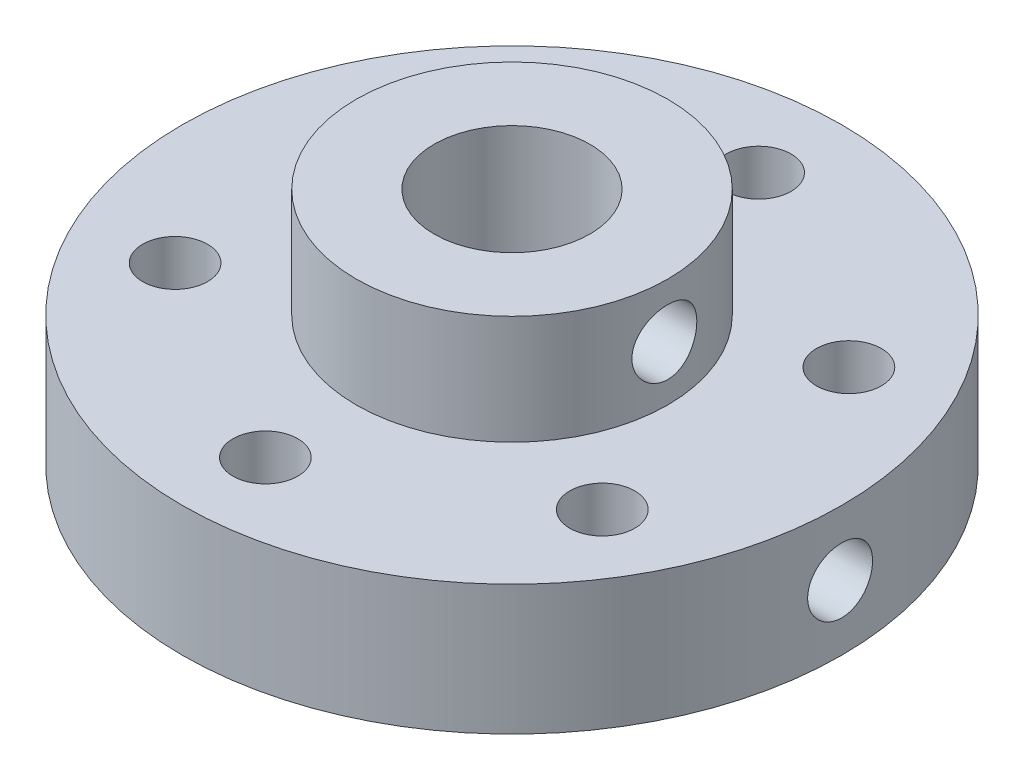
ISO-10303-21;
HEADER;
FILE_DESCRIPTION(('STEP AP214'),'2;1');
FILE_NAME('part.step','',(''),(''),'','','');
FILE_SCHEMA(('AUTOMOTIVE_DESIGN { 1 0 10303 214 1 1 1 1 }'));
ENDSEC;
DATA;
#1=APPLICATION_CONTEXT('core data for automotive mechanical design processes');
#2=APPLICATION_PROTOCOL_DEFINITION('international standard','automotive_design',2000,#1);
#3=PRODUCT_CONTEXT('',#1,'mechanical');
#4=PRODUCT('Part','Part','',(#3));
#5=PRODUCT_RELATED_PRODUCT_CATEGORY('part','',(#4));
#6=PRODUCT_DEFINITION_FORMATION('','',#4);
#7=PRODUCT_DEFINITION_CONTEXT('part definition',#1,'design');
#8=PRODUCT_DEFINITION('design','',#6,#7);
#9=PRODUCT_DEFINITION_SHAPE('','',#8);
#10=(LENGTH_UNIT() NAMED_UNIT(*) SI_UNIT(.MILLI.,.METRE.));
#11=(NAMED_UNIT(*) PLANE_ANGLE_UNIT() SI_UNIT($,.RADIAN.));
#12=(NAMED_UNIT(*) SI_UNIT($,.STERADIAN.) SOLID_ANGLE_UNIT());
#13=UNCERTAINTY_MEASURE_WITH_UNIT(LENGTH_MEASURE(1.E-05),#10,'distance_accuracy_value','');
#14=(GEOMETRIC_REPRESENTATION_CONTEXT(3) GLOBAL_UNCERTAINTY_ASSIGNED_CONTEXT((#13)) GLOBAL_UNIT_ASSIGNED_CONTEXT((#10,
#11,#12)) REPRESENTATION_CONTEXT('',''));
#15=CARTESIAN_POINT('',(0.,0.,0.));
#16=DIRECTION('',(0.,0.,1.));
#17=DIRECTION('',(1.,0.,0.));
#18=AXIS2_PLACEMENT_3D('',#15,#16,#17);
#19=CARTESIAN_POINT('',(0.,5.,0.));
#20=DIRECTION('',(0.,-1.,0.));
#21=DIRECTION('',(0.,0.,-1.));
#22=AXIS2_PLACEMENT_3D('',#19,#20,#21);
#23=CYLINDRICAL_SURFACE('',#22,12.7);
#24=CARTESIAN_POINT('',(12.7,1.25000000000001,0.));
#25=CARTESIAN_POINT('',(12.6999992053767,1.25000303546489,0.070031282644714));
#26=CARTESIAN_POINT('',(12.6994145852931,1.25590506924034,0.14010900678754));
#27=CARTESIAN_POINT('',(12.6971386355552,1.27936056646902,0.278322027844059));
#28=CARTESIAN_POINT('',(12.6954460831171,1.29692690368873,0.346455091701955));
#29=CARTESIAN_POINT('',(12.6911453487048,1.3431950211263,0.478757289636585));
#30=CARTESIAN_POINT('',(12.6885377162568,1.37189011935505,0.542928775594422));
#31=CARTESIAN_POINT('',(12.6826984877893,1.43958834239712,0.665530357530222));
#32=CARTESIAN_POINT('',(12.6794670168387,1.47858940161937,0.723961600791188));
#33=CARTESIAN_POINT('',(12.6727295439492,1.56593867561094,0.83364220140557));
#34=CARTESIAN_POINT('',(12.6692227211751,1.61431552194277,0.884868708381631));
#35=CARTESIAN_POINT('',(12.6623365830734,1.71898211143333,0.97848934124606));
#36=CARTESIAN_POINT('',(12.6589572736182,1.77527221846294,1.02088306075884));
#37=CARTESIAN_POINT('',(12.6527003451726,1.89431002660821,1.0957152991448));
#38=CARTESIAN_POINT('',(12.6498237705616,1.95707074991373,1.12813319805397));
#39=CARTESIAN_POINT('',(12.6449081047838,2.087177901841,1.18196189962952));
#40=CARTESIAN_POINT('',(12.6428689935324,2.15452422044288,1.20337296627196));
#41=CARTESIAN_POINT('',(12.6398664963312,2.2916581946059,1.23451262073334));
#42=CARTESIAN_POINT('',(12.6388996272722,2.36143718133028,1.24427904323655));
#43=CARTESIAN_POINT('',(12.6381402528445,2.50165010379155,1.25196912321572));
#44=CARTESIAN_POINT('',(12.6383477175131,2.57208402277234,1.24989308284717));
#45=CARTESIAN_POINT('',(12.6399103906683,2.71134679843134,1.23398836132345));
#46=CARTESIAN_POINT('',(12.6412615667039,2.7801804223952,1.22020097097041));
#47=CARTESIAN_POINT('',(12.6449531171045,2.91455192058459,1.18132916034646));
#48=CARTESIAN_POINT('',(12.647293504456,2.98008975152931,1.15624459176253));
#49=CARTESIAN_POINT('',(12.6527044143333,3.10613983710979,1.09544483971353));
#50=CARTESIAN_POINT('',(12.6557761946647,3.16664318915494,1.05971131587941));
#51=CARTESIAN_POINT('',(12.6623027037322,3.28080943580754,0.978641180257093));
#52=CARTESIAN_POINT('',(12.6657574433229,3.33447213642915,0.933304296235699));
#53=CARTESIAN_POINT('',(12.6726785733742,3.43367374710584,0.834083669760969));
#54=CARTESIAN_POINT('',(12.6761449506051,3.47917699540741,0.780164263845075));
#55=CARTESIAN_POINT('',(12.6826848403127,3.56049169399659,0.665433065104137));
#56=CARTESIAN_POINT('',(12.6857583523697,3.59630313392646,0.604621264913217));
#57=CARTESIAN_POINT('',(12.6911671737587,3.6572161493743,0.477806949734053));
#58=CARTESIAN_POINT('',(12.6935023599762,3.68231593898525,0.411803571347311));
#59=CARTESIAN_POINT('',(12.6971701449661,3.72106714583987,0.276491240194606));
#60=CARTESIAN_POINT('',(12.6985027727811,3.73471889471556,0.207182383244721));
#61=CARTESIAN_POINT('',(12.7000115586395,3.75014130971684,0.0675353800145732));
#62=CARTESIAN_POINT('',(12.7001925071073,3.7519611913186,-0.00279728138426438));
#63=CARTESIAN_POINT('',(12.6993903861296,3.74379744092128,-0.142766620743802));
#64=CARTESIAN_POINT('',(12.6984073319102,3.73381396331995,-0.21240330779641));
#65=CARTESIAN_POINT('',(12.6953907525744,3.70236771450181,-0.348862094124243));
#66=CARTESIAN_POINT('',(12.6933593343073,3.68092796338468,-0.415689548778695));
#67=CARTESIAN_POINT('',(12.6884739561919,3.62720140592747,-0.544799292661246));
#68=CARTESIAN_POINT('',(12.6856199784491,3.59491436360548,-0.607081482971614));
#69=CARTESIAN_POINT('',(12.6793968558126,3.52028751417399,-0.725555402313407));
#70=CARTESIAN_POINT('',(12.6760260651466,3.47791534442074,-0.781726658247026));
#71=CARTESIAN_POINT('',(12.6691529099366,3.38436746867763,-0.886177033231949));
#72=CARTESIAN_POINT('',(12.6656505421968,3.33319154874042,-0.934455960429511));
#73=CARTESIAN_POINT('',(12.6588945826013,3.22327424693378,-1.02192188780566));
#74=CARTESIAN_POINT('',(12.6556419005479,3.16450711355365,-1.0610766065567));
#75=CARTESIAN_POINT('',(12.6497673268535,3.04120270259734,-1.12896079934357));
#76=CARTESIAN_POINT('',(12.6471454268203,2.97666550180381,-1.1576904120812));
#77=CARTESIAN_POINT('',(12.6428348924729,2.84376400563288,-1.20385472580367));
#78=CARTESIAN_POINT('',(12.6411446671599,2.7754064554804,-1.22130869076843));
#79=CARTESIAN_POINT('',(12.6388838699205,2.63671346216954,-1.24448878134745));
#80=CARTESIAN_POINT('',(12.638313266975,2.56637807386188,-1.25021523187232));
#81=CARTESIAN_POINT('',(12.6383569507631,2.42604681895445,-1.24977330937529));
#82=CARTESIAN_POINT('',(12.6389661859801,2.35605078555568,-1.24365564734898));
#83=CARTESIAN_POINT('',(12.6412901330464,2.21808591692656,-1.21980542436042));
#84=CARTESIAN_POINT('',(12.6430048461901,2.15011708406989,-1.20207284979864));
#85=CARTESIAN_POINT('',(12.6473451495994,2.01813601419489,-1.15551004195296));
#86=CARTESIAN_POINT('',(12.6499706224057,1.95412326821993,-1.12668123967943));
#87=CARTESIAN_POINT('',(12.6558368552843,1.83183715655239,-1.05874958964908));
#88=CARTESIAN_POINT('',(12.6590776112807,1.77356375284336,-1.01964680995167));
#89=CARTESIAN_POINT('',(12.6658258690576,1.66415061890367,-0.932086701457343));
#90=CARTESIAN_POINT('',(12.669334412013,1.61304117952309,-0.883591601308586));
#91=CARTESIAN_POINT('',(12.6762134065084,1.5196628547399,-0.778697716558491));
#92=CARTESIAN_POINT('',(12.6795838247362,1.47739609199077,-0.722297039664839));
#93=CARTESIAN_POINT('',(12.6858153424876,1.40282209313431,-0.603042575710224));
#94=CARTESIAN_POINT('',(12.6886751741136,1.37053950839737,-0.540173319004092));
#95=CARTESIAN_POINT('',(12.6935494159781,1.31703208850351,-0.409918728568402));
#96=CARTESIAN_POINT('',(12.6955647808325,1.29579476079758,-0.342538594616495));
#97=CARTESIAN_POINT('',(12.6980154922455,1.27028784430099,-0.228979465526957));
#98=CARTESIAN_POINT('',(12.6987562208227,1.262690268693,-0.183526855955049));
#99=CARTESIAN_POINT('',(12.6997487349209,1.252545358806,-0.0920561862478505));
#100=CARTESIAN_POINT('',(12.7000005223804,1.24999800450433,-0.0460381283551261));
#101=CARTESIAN_POINT('',(12.7,1.25000000000001,0.));
#102=B_SPLINE_CURVE_WITH_KNOTS('',3,(#24,#25,#26,#27,#28,#29,#30,#31,#32,#33,#34,#35,#36,#37,
#38,#39,#40,#41,#42,#43,#44,#45,#46,#47,#48,#49,#50,#51,#52,#53,#54,#55,#56,#57,#58,#59,#60,#61,
#62,#63,#64,#65,#66,#67,#68,#69,#70,#71,#72,#73,#74,#75,#76,#77,#78,#79,#80,#81,#82,#83,#84,#85,
#86,#87,#88,#89,#90,#91,#92,#93,#94,#95,#96,#97,#98,#99,#100,#101),.UNSPECIFIED.,.T.,.F.,(4,2,2,
2,2,2,2,2,2,2,2,2,2,2,2,2,2,2,2,2,2,2,2,2,2,2,2,2,2,2,2,2,2,2,2,2,2,2,4),(0.,0.209925736404034,
0.420083551553886,0.630115377513741,0.840105139347868,1.05074656548351,1.26139768059231,
1.47248133014627,1.68355991706029,1.89395080193954,2.10433631880757,2.31398314193358,
2.5236327174513,2.73364547350684,2.94366418373849,3.1545795451684,3.36549513200488,
3.57644587015761,3.78739049718266,3.99745712088701,4.20752099677557,4.41716435140816,
4.62681226710988,4.83714222417453,5.04747729336668,5.25854559674413,5.46961109184048,
5.68031502987036,5.89101313027177,6.10081111385635,6.31060934308735,6.52038052502717,
6.73015031738428,6.94078190789724,7.15146400191706,7.36266220124826,7.57362100612732,
7.71162542287026,7.84962929246443),.UNSPECIFIED.);
#103=CARTESIAN_POINT('',(12.7,1.25000000000001,0.));
#104=VERTEX_POINT('',#103);
#105=EDGE_CURVE('E64',#104,#104,#102,.T.);
#106=ORIENTED_EDGE('',*,*,#105,.T.);
#107=EDGE_LOOP('',(#106));
#108=FACE_BOUND('',#107,.T.);
#109=CARTESIAN_POINT('',(0.,5.,0.));
#110=DIRECTION('',(0.,1.,0.));
#111=DIRECTION('',(0.,0.,1.));
#112=AXIS2_PLACEMENT_3D('',#109,#110,#111);
#113=CIRCLE('',#112,12.7);
#114=CARTESIAN_POINT('',(0.,5.,12.7));
#115=VERTEX_POINT('',#114);
#116=EDGE_CURVE('E44',#115,#115,#113,.T.);
#117=ORIENTED_EDGE('',*,*,#116,.F.);
#118=EDGE_LOOP('',(#117));
#119=FACE_BOUND('',#118,.T.);
#120=CARTESIAN_POINT('',(0.,0.,0.));
#121=DIRECTION('',(0.,1.,0.));
#122=DIRECTION('',(0.,0.,1.));
#123=AXIS2_PLACEMENT_3D('',#120,#121,#122);
#124=CIRCLE('',#123,12.7);
#125=CARTESIAN_POINT('',(0.,0.,12.7));
#126=VERTEX_POINT('',#125);
#127=EDGE_CURVE('E49',#126,#126,#124,.T.);
#128=ORIENTED_EDGE('',*,*,#127,.T.);
#129=EDGE_LOOP('',(#128));
#130=FACE_BOUND('',#129,.T.);
#131=ADVANCED_FACE('F31',(#108,#119,#130),#23,.T.);
#132=CARTESIAN_POINT('',(0.,5.,0.));
#133=DIRECTION('',(0.,1.,0.));
#134=DIRECTION('',(0.,0.,1.));
#135=AXIS2_PLACEMENT_3D('',#132,#133,#134);
#136=PLANE('',#135);
#137=CARTESIAN_POINT('',(0.,5.,-9.5));
#138=DIRECTION('',(0.,1.,0.));
#139=DIRECTION('',(0.,0.,1.));
#140=AXIS2_PLACEMENT_3D('',#137,#138,#139);
#141=CIRCLE('',#140,1.25);
#142=CARTESIAN_POINT('',(0.,5.,-8.25));
#143=VERTEX_POINT('',#142);
#144=EDGE_CURVE('E86',#143,#143,#141,.T.);
#145=ORIENTED_EDGE('',*,*,#144,.F.);
#146=EDGE_LOOP('',(#145));
#147=FACE_BOUND('',#146,.T.);
#148=CARTESIAN_POINT('',(8.22724133595237,5.,-4.75000000000035));
#149=DIRECTION('',(0.,1.,0.));
#150=DIRECTION('',(0.,0.,1.));
#151=AXIS2_PLACEMENT_3D('',#148,#149,#150);
#152=CIRCLE('',#151,1.25);
#153=CARTESIAN_POINT('',(8.22724133595237,5.,-3.50000000000035));
#154=VERTEX_POINT('',#153);
#155=EDGE_CURVE('E177',#154,#154,#152,.T.);
#156=ORIENTED_EDGE('',*,*,#155,.F.);
#157=EDGE_LOOP('',(#156));
#158=FACE_BOUND('',#157,.T.);
#159=CARTESIAN_POINT('',(8.22724133595277,5.,4.74999999999965));
#160=DIRECTION('',(0.,1.,0.));
#161=DIRECTION('',(0.,0.,1.));
#162=AXIS2_PLACEMENT_3D('',#159,#160,#161);
#163=CIRCLE('',#162,1.25);
#164=CARTESIAN_POINT('',(8.22724133595277,5.,5.99999999999965));
#165=VERTEX_POINT('',#164);
#166=EDGE_CURVE('E173',#165,#165,#163,.T.);
#167=ORIENTED_EDGE('',*,*,#166,.F.);
#168=EDGE_LOOP('',(#167));
#169=FACE_BOUND('',#168,.T.);
#170=CARTESIAN_POINT('',(8.06528475388944E-13,5.,9.5));
#171=DIRECTION('',(0.,1.,0.));
#172=DIRECTION('',(0.,0.,1.));
#173=AXIS2_PLACEMENT_3D('',#170,#171,#172);
#174=CIRCLE('',#173,1.25);
#175=CARTESIAN_POINT('',(8.06528475388944E-13,5.,10.75));
#176=VERTEX_POINT('',#175);
#177=EDGE_CURVE('E169',#176,#176,#174,.T.);
#178=ORIENTED_EDGE('',*,*,#177,.F.);
#179=EDGE_LOOP('',(#178));
#180=FACE_BOUND('',#179,.T.);
#181=CARTESIAN_POINT('',(-8.22724133595156,5.,4.75000000000035));
#182=DIRECTION('',(0.,1.,0.));
#183=DIRECTION('',(0.,0.,1.));
#184=AXIS2_PLACEMENT_3D('',#181,#182,#183);
#185=CIRCLE('',#184,1.25);
#186=CARTESIAN_POINT('',(-8.22724133595156,5.,6.00000000000035));
#187=VERTEX_POINT('',#186);
#188=EDGE_CURVE('E165',#187,#187,#185,.T.);
#189=ORIENTED_EDGE('',*,*,#188,.F.);
#190=EDGE_LOOP('',(#189));
#191=FACE_BOUND('',#190,.T.);
#192=CARTESIAN_POINT('',(-8.22724133595197,5.,-4.74999999999965));
#193=DIRECTION('',(0.,1.,0.));
#194=DIRECTION('',(0.,0.,1.));
#195=AXIS2_PLACEMENT_3D('',#192,#193,#194);
#196=CIRCLE('',#195,1.25);
#197=CARTESIAN_POINT('',(-8.22724133595197,5.,-3.49999999999965));
#198=VERTEX_POINT('',#197);
#199=EDGE_CURVE('E161',#198,#198,#196,.T.);
#200=ORIENTED_EDGE('',*,*,#199,.F.);
#201=EDGE_LOOP('',(#200));
#202=FACE_BOUND('',#201,.T.);
#203=CARTESIAN_POINT('',(0.,5.,0.));
#204=DIRECTION('',(0.,1.,0.));
#205=DIRECTION('',(0.,0.,1.));
#206=AXIS2_PLACEMENT_3D('',#203,#204,#205);
#207=CIRCLE('',#206,6.);
#208=CARTESIAN_POINT('',(0.,5.,6.));
#209=VERTEX_POINT('',#208);
#210=EDGE_CURVE('E10',#209,#209,#207,.T.);
#211=ORIENTED_EDGE('',*,*,#210,.F.);
#212=EDGE_LOOP('',(#211));
#213=FACE_BOUND('',#212,.T.);
#214=ORIENTED_EDGE('',*,*,#116,.T.);
#215=EDGE_LOOP('',(#214));
#216=FACE_BOUND('',#215,.T.);
#217=ADVANCED_FACE('F110',(#147,#158,#169,#180,#191,#202,#213,#216),#136,.T.);
#218=CARTESIAN_POINT('',(0.,0.,0.));
#219=DIRECTION('',(0.,1.,0.));
#220=DIRECTION('',(0.,0.,1.));
#221=AXIS2_PLACEMENT_3D('',#218,#219,#220);
#222=PLANE('',#221);
#223=CARTESIAN_POINT('',(0.,0.,-9.5));
#224=DIRECTION('',(0.,1.,0.));
#225=DIRECTION('',(0.,0.,1.));
#226=AXIS2_PLACEMENT_3D('',#223,#224,#225);
#227=CIRCLE('',#226,1.25);
#228=CARTESIAN_POINT('',(0.,0.,-8.25));
#229=VERTEX_POINT('',#228);
#230=EDGE_CURVE('E130',#229,#229,#227,.T.);
#231=ORIENTED_EDGE('',*,*,#230,.T.);
#232=EDGE_LOOP('',(#231));
#233=FACE_BOUND('',#232,.T.);
#234=CARTESIAN_POINT('',(8.22724133595237,0.,-4.75000000000035));
#235=DIRECTION('',(0.,1.,0.));
#236=DIRECTION('',(0.,0.,1.));
#237=AXIS2_PLACEMENT_3D('',#234,#235,#236);
#238=CIRCLE('',#237,1.25);
#239=CARTESIAN_POINT('',(8.22724133595237,0.,-3.50000000000035));
#240=VERTEX_POINT('',#239);
#241=EDGE_CURVE('E134',#240,#240,#238,.T.);
#242=ORIENTED_EDGE('',*,*,#241,.T.);
#243=EDGE_LOOP('',(#242));
#244=FACE_BOUND('',#243,.T.);
#245=CARTESIAN_POINT('',(8.22724133595277,0.,4.74999999999965));
#246=DIRECTION('',(0.,1.,0.));
#247=DIRECTION('',(0.,0.,1.));
#248=AXIS2_PLACEMENT_3D('',#245,#246,#247);
#249=CIRCLE('',#248,1.25);
#250=CARTESIAN_POINT('',(8.22724133595277,0.,5.99999999999965));
#251=VERTEX_POINT('',#250);
#252=EDGE_CURVE('E138',#251,#251,#249,.T.);
#253=ORIENTED_EDGE('',*,*,#252,.T.);
#254=EDGE_LOOP('',(#253));
#255=FACE_BOUND('',#254,.T.);
#256=CARTESIAN_POINT('',(8.06528475388944E-13,0.,9.5));
#257=DIRECTION('',(0.,1.,0.));
#258=DIRECTION('',(0.,0.,1.));
#259=AXIS2_PLACEMENT_3D('',#256,#257,#258);
#260=CIRCLE('',#259,1.25);
#261=CARTESIAN_POINT('',(8.06528475388944E-13,0.,10.75));
#262=VERTEX_POINT('',#261);
#263=EDGE_CURVE('E142',#262,#262,#260,.T.);
#264=ORIENTED_EDGE('',*,*,#263,.T.);
#265=EDGE_LOOP('',(#264));
#266=FACE_BOUND('',#265,.T.);
#267=CARTESIAN_POINT('',(-8.22724133595156,0.,4.75000000000035));
#268=DIRECTION('',(0.,1.,0.));
#269=DIRECTION('',(0.,0.,1.));
#270=AXIS2_PLACEMENT_3D('',#267,#268,#269);
#271=CIRCLE('',#270,1.25);
#272=CARTESIAN_POINT('',(-8.22724133595156,0.,6.00000000000035));
#273=VERTEX_POINT('',#272);
#274=EDGE_CURVE('E146',#273,#273,#271,.T.);
#275=ORIENTED_EDGE('',*,*,#274,.T.);
#276=EDGE_LOOP('',(#275));
#277=FACE_BOUND('',#276,.T.);
#278=CARTESIAN_POINT('',(-8.22724133595197,0.,-4.74999999999965));
#279=DIRECTION('',(0.,1.,0.));
#280=DIRECTION('',(0.,0.,1.));
#281=AXIS2_PLACEMENT_3D('',#278,#279,#280);
#282=CIRCLE('',#281,1.25);
#283=CARTESIAN_POINT('',(-8.22724133595197,0.,-3.49999999999966));
#284=VERTEX_POINT('',#283);
#285=EDGE_CURVE('E150',#284,#284,#282,.T.);
#286=ORIENTED_EDGE('',*,*,#285,.T.);
#287=EDGE_LOOP('',(#286));
#288=FACE_BOUND('',#287,.T.);
#289=CARTESIAN_POINT('',(0.,0.,0.));
#290=DIRECTION('',(0.,1.,0.));
#291=DIRECTION('',(0.,0.,1.));
#292=AXIS2_PLACEMENT_3D('',#289,#290,#291);
#293=CIRCLE('',#292,3.);
#294=CARTESIAN_POINT('',(0.,0.,3.));
#295=VERTEX_POINT('',#294);
#296=EDGE_CURVE('E153',#295,#295,#293,.T.);
#297=ORIENTED_EDGE('',*,*,#296,.T.);
#298=EDGE_LOOP('',(#297));
#299=FACE_BOUND('',#298,.T.);
#300=ORIENTED_EDGE('',*,*,#127,.F.);
#301=EDGE_LOOP('',(#300));
#302=FACE_BOUND('',#301,.T.);
#303=ADVANCED_FACE('F105',(#233,#244,#255,#266,#277,#288,#299,#302),#222,.F.);
#304=CARTESIAN_POINT('',(0.,9.2,0.));
#305=DIRECTION('',(0.,-1.,0.));
#306=DIRECTION('',(0.,0.,-1.));
#307=AXIS2_PLACEMENT_3D('',#304,#305,#306);
#308=CYLINDRICAL_SURFACE('',#307,6.);
#309=CARTESIAN_POINT('',(5.86834729715275,7.1,1.24999999999999));
#310=CARTESIAN_POINT('',(5.86834869213645,7.16939061515103,1.24999750877599));
#311=CARTESIAN_POINT('',(5.86959145924544,7.23881197201522,1.24420229433947));
#312=CARTESIAN_POINT('',(5.87442015581798,7.37568631731724,1.22119649233778));
#313=CARTESIAN_POINT('',(5.87800788138388,7.44313775550642,1.20397715440341));
#314=CARTESIAN_POINT('',(5.8871029296193,7.57407237283486,1.15868397507229));
#315=CARTESIAN_POINT('',(5.89260825706945,7.6375595959918,1.13062141248932));
#316=CARTESIAN_POINT('',(5.90491581335741,7.7589244996456,1.06446988601732));
#317=CARTESIAN_POINT('',(5.91171798977622,7.81680240673001,1.02638132735819));
#318=CARTESIAN_POINT('',(5.92596934661468,7.92619537515346,0.940636399466077));
#319=CARTESIAN_POINT('',(5.93342614373039,7.97761189362646,0.892855554869664));
#320=CARTESIAN_POINT('',(5.94807966802575,8.07176106864809,0.789351223880633));
#321=CARTESIAN_POINT('',(5.95527637609915,8.11449308829143,0.733627155455999));
#322=CARTESIAN_POINT('',(5.96868135118848,8.19044588808285,0.615162052999585));
#323=CARTESIAN_POINT('',(5.97487958631242,8.22357252646325,0.552359428204939));
#324=CARTESIAN_POINT('',(5.98550347343302,8.27876605285977,0.421928551006718));
#325=CARTESIAN_POINT('',(5.98992930561222,8.30083406515352,0.35430078995059));
#326=CARTESIAN_POINT('',(5.99645589892179,8.33297576111746,0.217162904200502));
#327=CARTESIAN_POINT('',(5.99858891959926,8.34321601719516,0.147693380916357));
#328=CARTESIAN_POINT('',(6.00040112580612,8.35193169575701,0.00799184883952487));
#329=CARTESIAN_POINT('',(6.0000805670369,8.3504083441931,-0.0622400797368376));
#330=CARTESIAN_POINT('',(5.99704658090511,8.33576539904325,-0.20032658619957));
#331=CARTESIAN_POINT('',(5.99437018956584,8.32282528104187,-0.268201128726473));
#332=CARTESIAN_POINT('',(5.98696720898885,8.28600137466869,-0.400793746289749));
#333=CARTESIAN_POINT('',(5.98224053291904,8.26211712279692,-0.465511687511019));
#334=CARTESIAN_POINT('',(5.97120767323924,8.20391994787449,-0.59046000538468));
#335=CARTESIAN_POINT('',(5.96489104125346,8.16953770579033,-0.650657134981645));
#336=CARTESIAN_POINT('',(5.95137300440189,8.09137199715958,-0.764493456510643));
#337=CARTESIAN_POINT('',(5.94417148958325,8.04758736179387,-0.818131831816413));
#338=CARTESIAN_POINT('',(5.92951700233276,7.95087837510894,-0.918394203276906));
#339=CARTESIAN_POINT('',(5.92206184975925,7.89779694001805,-0.964866487494788));
#340=CARTESIAN_POINT('',(5.90786872648996,7.7845179510052,-1.04827597240487));
#341=CARTESIAN_POINT('',(5.9011307717716,7.72432023861276,-1.08521296069979));
#342=CARTESIAN_POINT('',(5.88912998409156,7.5982877451712,-1.14856217138453));
#343=CARTESIAN_POINT('',(5.88387085232125,7.53243934930656,-1.17494805489726));
#344=CARTESIAN_POINT('',(5.8754760641036,7.39710838063061,-1.21623577538672));
#345=CARTESIAN_POINT('',(5.87234010507182,7.32762632719191,-1.23113924882348));
#346=CARTESIAN_POINT('',(5.86860783239132,7.18838029368109,-1.24880863867017));
#347=CARTESIAN_POINT('',(5.86796551863474,7.11864541546297,-1.25179442917998));
#348=CARTESIAN_POINT('',(5.86916952018704,6.97967418845986,-1.24613693439293));
#349=CARTESIAN_POINT('',(5.87101568152624,6.91043780909767,-1.23749436857862));
#350=CARTESIAN_POINT('',(5.87694538226166,6.77517948394188,-1.20901558325483));
#351=CARTESIAN_POINT('',(5.88100511282997,6.70913133282118,-1.18929841376871));
#352=CARTESIAN_POINT('',(5.8908833850312,6.5812760105584,-1.13935810860918));
#353=CARTESIAN_POINT('',(5.89670208191057,6.5194692143496,-1.10913404556146));
#354=CARTESIAN_POINT('',(5.90954501937191,6.40089355878378,-1.03854598181484));
#355=CARTESIAN_POINT('',(5.91658506648323,6.34420779553384,-0.998045327353956));
#356=CARTESIAN_POINT('',(5.93103483993908,6.23835675084494,-0.908234440569873));
#357=CARTESIAN_POINT('',(5.93844460766532,6.18919231376078,-0.858923220505167));
#358=CARTESIAN_POINT('',(5.95294924316736,6.09893728690284,-0.751900450843335));
#359=CARTESIAN_POINT('',(5.9600367471991,6.05799590497362,-0.694061907614548));
#360=CARTESIAN_POINT('',(5.97296708772407,5.98641124791203,-0.572200102216357));
#361=CARTESIAN_POINT('',(5.97880997920818,5.95576751776256,-0.508177113476879));
#362=CARTESIAN_POINT('',(5.98856148270678,5.90586132068266,-0.376142117847918));
#363=CARTESIAN_POINT('',(5.99248163136497,5.88653083445567,-0.308156710970194));
#364=CARTESIAN_POINT('',(5.99799561410226,5.85958559599191,-0.169813400503472));
#365=CARTESIAN_POINT('',(5.99958975342889,5.85196930646727,-0.0994558094616955));
#366=CARTESIAN_POINT('',(6.00026408056941,5.8487323779515,0.0402133434703383));
#367=CARTESIAN_POINT('',(5.99939113754811,5.85288810000528,0.109519592177921));
#368=CARTESIAN_POINT('',(5.99532874094472,5.87258063865294,0.24642287037355));
#369=CARTESIAN_POINT('',(5.99213932172839,5.88811728640678,0.3140199252027));
#370=CARTESIAN_POINT('',(5.98380460077544,5.93002779464857,0.445431965492049));
#371=CARTESIAN_POINT('',(5.97866453407556,5.95637266385311,0.50925655000452));
#372=CARTESIAN_POINT('',(5.96697995347704,6.01912239773201,0.631610567220737));
#373=CARTESIAN_POINT('',(5.96043531730246,6.05552813834314,0.690139538279506));
#374=CARTESIAN_POINT('',(5.94651596786386,6.13810966799331,0.801340321298255));
#375=CARTESIAN_POINT('',(5.93912880302851,6.18444428805671,0.853892633615921));
#376=CARTESIAN_POINT('',(5.9244278681135,6.28524450099709,0.950552741980379));
#377=CARTESIAN_POINT('',(5.91711411595368,6.33971202994844,0.994658521571225));
#378=CARTESIAN_POINT('',(5.90329191643327,6.45600910243344,1.07367451852766));
#379=CARTESIAN_POINT('',(5.89679406702551,6.5179184114621,1.10846928126993));
#380=CARTESIAN_POINT('',(5.88547039658063,6.64682515608327,1.16710627925305));
#381=CARTESIAN_POINT('',(5.88064310352601,6.71381804845301,1.19095816292459));
#382=CARTESIAN_POINT('',(5.87414004405196,6.83410628156844,1.2225655413186));
#383=CARTESIAN_POINT('',(5.87198163591589,6.88672953659306,1.23283449005669));
#384=CARTESIAN_POINT('',(5.86908475266778,6.99289578052101,1.24655254358403));
#385=CARTESIAN_POINT('',(5.86834622039193,7.04643873231004,1.2500019229274));
#386=CARTESIAN_POINT('',(5.86834729715275,7.1,1.24999999999999));
#387=B_SPLINE_CURVE_WITH_KNOTS('',3,(#309,#310,#311,#312,#313,#314,#315,#316,#317,#318,#319,
#320,#321,#322,#323,#324,#325,#326,#327,#328,#329,#330,#331,#332,#333,#334,#335,#336,#337,#338,
#339,#340,#341,#342,#343,#344,#345,#346,#347,#348,#349,#350,#351,#352,#353,#354,#355,#356,#357,
#358,#359,#360,#361,#362,#363,#364,#365,#366,#367,#368,#369,#370,#371,#372,#373,#374,#375,#376,
#377,#378,#379,#380,#381,#382,#383,#384,#385,#386),.UNSPECIFIED.,.T.,.F.,(4,2,2,2,2,2,2,2,2,2,2,
2,2,2,2,2,2,2,2,2,2,2,2,2,2,2,2,2,2,2,2,2,2,2,2,2,2,2,4),(0.,0.207975654071268,
0.416110792417467,0.624030014802724,0.831940834815784,1.04271333467884,1.25350128663873,
1.46629026266843,1.67905760106932,1.88879048859263,2.09850151896337,2.30497341416459,
2.51145405455869,2.71932871977947,2.92722924104258,3.13905862244911,3.35089272191626,
3.56325237332485,3.77558175387594,3.98397516009789,4.19235567296521,4.3985378623192,
4.60473825464028,4.81383917934648,5.02296356082182,5.2355945875334,5.44821621759036,
5.6595459964853,5.87084803959577,6.07816293922641,6.28547476332977,6.49223410585096,
6.69901145528169,6.90938318978569,7.1198050842753,7.33272651358118,7.54545984571983,
7.70599867585764,7.86653104261155),.UNSPECIFIED.);
#388=CARTESIAN_POINT('',(5.86834729715275,7.1,1.24999999999999));
#389=VERTEX_POINT('',#388);
#390=EDGE_CURVE('E56',#389,#389,#387,.T.);
#391=ORIENTED_EDGE('',*,*,#390,.T.);
#392=EDGE_LOOP('',(#391));
#393=FACE_BOUND('',#392,.T.);
#394=CARTESIAN_POINT('',(0.,9.2,0.));
#395=DIRECTION('',(0.,1.,0.));
#396=DIRECTION('',(0.,0.,1.));
#397=AXIS2_PLACEMENT_3D('',#394,#395,#396);
#398=CIRCLE('',#397,6.);
#399=CARTESIAN_POINT('',(0.,9.2,6.));
#400=VERTEX_POINT('',#399);
#401=EDGE_CURVE('E52',#400,#400,#398,.T.);
#402=ORIENTED_EDGE('',*,*,#401,.F.);
#403=EDGE_LOOP('',(#402));
#404=FACE_BOUND('',#403,.T.);
#405=ORIENTED_EDGE('',*,*,#210,.T.);
#406=EDGE_LOOP('',(#405));
#407=FACE_BOUND('',#406,.T.);
#408=ADVANCED_FACE('F65',(#393,#404,#407),#308,.T.);
#409=CARTESIAN_POINT('',(0.,9.2,0.));
#410=DIRECTION('',(0.,1.,0.));
#411=DIRECTION('',(0.,0.,1.));
#412=AXIS2_PLACEMENT_3D('',#409,#410,#411);
#413=PLANE('',#412);
#414=CARTESIAN_POINT('',(0.,9.2,0.));
#415=DIRECTION('',(0.,1.,0.));
#416=DIRECTION('',(0.,0.,1.));
#417=AXIS2_PLACEMENT_3D('',#414,#415,#416);
#418=CIRCLE('',#417,3.);
#419=CARTESIAN_POINT('',(0.,9.2,3.));
#420=VERTEX_POINT('',#419);
#421=EDGE_CURVE('E155',#420,#420,#418,.T.);
#422=ORIENTED_EDGE('',*,*,#421,.F.);
#423=EDGE_LOOP('',(#422));
#424=FACE_BOUND('',#423,.T.);
#425=ORIENTED_EDGE('',*,*,#401,.T.);
#426=EDGE_LOOP('',(#425));
#427=FACE_BOUND('',#426,.T.);
#428=ADVANCED_FACE('F96',(#424,#427),#413,.T.);
#429=CARTESIAN_POINT('',(0.,0.,0.));
#430=DIRECTION('',(0.,1.,0.));
#431=DIRECTION('',(0.,0.,1.));
#432=AXIS2_PLACEMENT_3D('',#429,#430,#431);
#433=CYLINDRICAL_SURFACE('',#432,3.);
#434=CARTESIAN_POINT('',(2.72717802865893,2.5,1.24999999999999));
#435=CARTESIAN_POINT('',(2.7271851956322,2.43332810910315,1.24999259066567));
#436=CARTESIAN_POINT('',(2.72965859534401,2.36654734317379,1.24463203881502));
#437=CARTESIAN_POINT('',(2.73923833650884,2.23491305794286,1.22339678947784));
#438=CARTESIAN_POINT('',(2.74635725824267,2.17006527332477,1.20749354003276));
#439=CARTESIAN_POINT('',(2.76426917574768,2.04443887030893,1.1658998841945));
#440=CARTESIAN_POINT('',(2.77504717562616,1.98364483628499,1.14024937431427));
#441=CARTESIAN_POINT('',(2.79904148565793,1.86724055042195,1.08000637754462));
#442=CARTESIAN_POINT('',(2.81225721880784,1.81162907656688,1.0454160059153));
#443=CARTESIAN_POINT('',(2.84055762619857,1.70367427502654,0.965973882676159));
#444=CARTESIAN_POINT('',(2.85570568079146,1.65169244125591,0.920653238184401));
#445=CARTESIAN_POINT('',(2.88564295372227,1.55579977750245,0.822021675745543));
#446=CARTESIAN_POINT('',(2.90043203180789,1.51189205938699,0.768707691373998));
#447=CARTESIAN_POINT('',(2.92875537930614,1.43155046912073,0.652763393797343));
#448=CARTESIAN_POINT('',(2.94220739975291,1.39552337196766,0.589829293683654));
#449=CARTESIAN_POINT('',(2.96556519993426,1.3347239794944,0.458132022362349));
#450=CARTESIAN_POINT('',(2.97547255347157,1.30994668803579,0.389371454872121));
#451=CARTESIAN_POINT('',(2.99017521042367,1.27366054124327,0.251768498025163));
#452=CARTESIAN_POINT('',(2.99520971127466,1.26152830509796,0.183116576196078));
#453=CARTESIAN_POINT('',(3.00046828611204,1.24886235884015,0.0445791803650048));
#454=CARTESIAN_POINT('',(3.00069431131015,1.24832394411705,-0.0253057817645172));
#455=CARTESIAN_POINT('',(2.99645129133057,1.25853428093333,-0.159792780112568));
#456=CARTESIAN_POINT('',(2.99226714648664,1.26859810052574,-0.224457488607313));
#457=CARTESIAN_POINT('',(2.98006516750309,1.29855310263817,-0.351082893931455));
#458=CARTESIAN_POINT('',(2.97204705074577,1.31844500963017,-0.413043391054914));
#459=CARTESIAN_POINT('',(2.95279852414029,1.36772804089465,-0.533638118077523));
#460=CARTESIAN_POINT('',(2.94152097126085,1.39725946287083,-0.592207177074903));
#461=CARTESIAN_POINT('',(2.91685713989805,1.46484575670035,-0.70371176728196));
#462=CARTESIAN_POINT('',(2.90347011666255,1.50290364084499,-0.75664529775697));
#463=CARTESIAN_POINT('',(2.87481698777061,1.58958242040462,-0.859340911707919));
#464=CARTESIAN_POINT('',(2.8594849435601,1.63875879127901,-0.908616437316235));
#465=CARTESIAN_POINT('',(2.82937860681471,1.74471144070659,-0.998431414927662));
#466=CARTESIAN_POINT('',(2.8146045313137,1.8014906382921,-1.03896749582431));
#467=CARTESIAN_POINT('',(2.78681612355339,1.92339503666192,-1.11140189250063));
#468=CARTESIAN_POINT('',(2.77387558556715,1.98873320574329,-1.14297253355539));
#469=CARTESIAN_POINT('',(2.75209844221011,2.1244810449745,-1.19446432058391));
#470=CARTESIAN_POINT('',(2.74325890334594,2.19488704826955,-1.21439379627312));
#471=CARTESIAN_POINT('',(2.73141212519724,2.333896808914,-1.2408002516812));
#472=CARTESIAN_POINT('',(2.72806369197117,2.40232112225905,-1.24806614632865));
#473=CARTESIAN_POINT('',(2.72660286810642,2.5394784824115,-1.25125630518998));
#474=CARTESIAN_POINT('',(2.72848866599319,2.60821141419171,-1.24718449318148));
#475=CARTESIAN_POINT('',(2.7369313134575,2.73939838543045,-1.22853477565555));
#476=CARTESIAN_POINT('',(2.74318138016618,2.8019726867868,-1.21464618818047));
#477=CARTESIAN_POINT('',(2.75925630297447,2.92385129649787,-1.17767058564224));
#478=CARTESIAN_POINT('',(2.76908199460161,2.98315483683071,-1.15458142053124));
#479=CARTESIAN_POINT('',(2.79170797857001,3.09961531035647,-1.09877520805186));
#480=CARTESIAN_POINT('',(2.80461662202283,3.15657497461032,-1.06569183306197));
#481=CARTESIAN_POINT('',(2.83180003740794,3.26440805249902,-0.991200784385962));
#482=CARTESIAN_POINT('',(2.84607539920584,3.31527881670186,-0.949789507875979));
#483=CARTESIAN_POINT('',(2.87578619784533,3.413800134884,-0.855844455715497));
#484=CARTESIAN_POINT('',(2.89122146708842,3.46085139995065,-0.80267966147973));
#485=CARTESIAN_POINT('',(2.92043361183923,3.54547229197932,-0.688851512553532));
#486=CARTESIAN_POINT('',(2.93421036577014,3.58304122406369,-0.62818760880365));
#487=CARTESIAN_POINT('',(2.9586425158565,3.64758987544357,-0.500654680803378));
#488=CARTESIAN_POINT('',(2.96928983138826,3.67454224128947,-0.433770169638501));
#489=CARTESIAN_POINT('',(2.98618173103366,3.71661679233442,-0.295858835154412));
#490=CARTESIAN_POINT('',(2.9924289351992,3.73174601822606,-0.224834504225191));
#491=CARTESIAN_POINT('',(2.9995153479751,3.7488581255203,-0.0860165335064078));
#492=CARTESIAN_POINT('',(3.00070204534225,3.75168599969695,-0.0183440847938951));
#493=CARTESIAN_POINT('',(2.99849523480953,3.74638685870605,0.116486811714287));
#494=CARTESIAN_POINT('',(2.99510252984313,3.73826176398712,0.183645347541156));
#495=CARTESIAN_POINT('',(2.98430065981734,3.71189392784133,0.313086482449185));
#496=CARTESIAN_POINT('',(2.97703824209233,3.69402031953044,0.375457537843569));
#497=CARTESIAN_POINT('',(2.95929499847058,3.64906575279086,0.49629223050133));
#498=CARTESIAN_POINT('',(2.94881356124207,3.62198304533509,0.554755122985826));
#499=CARTESIAN_POINT('',(2.92505825398663,3.55801047078553,0.669024565478779));
#500=CARTESIAN_POINT('',(2.91167959188766,3.520732698576,0.724591657976679));
#501=CARTESIAN_POINT('',(2.88371561874231,3.4379928171281,0.828918675638778));
#502=CARTESIAN_POINT('',(2.86912986083797,3.39252766959324,0.877676061786039));
#503=CARTESIAN_POINT('',(2.83914845259141,3.29105517414559,0.970449787231576));
#504=CARTESIAN_POINT('',(2.82376522857896,3.23454098537887,1.01391775364846));
#505=CARTESIAN_POINT('',(2.79495552690186,3.1145412593198,1.09083332306674));
#506=CARTESIAN_POINT('',(2.78153014522558,3.05105185194185,1.12427532456754));
#507=CARTESIAN_POINT('',(2.75842557732643,2.91905616497724,1.17982766043576));
#508=CARTESIAN_POINT('',(2.74872654469865,2.85057884120679,1.20199823632853));
#509=CARTESIAN_POINT('',(2.73440803066668,2.71046042614933,1.234235564538));
#510=CARTESIAN_POINT('',(2.72977151604981,2.6388307927257,1.24434291521209));
#511=CARTESIAN_POINT('',(2.72744979732688,2.54464147573811,1.24940464923649));
#512=CARTESIAN_POINT('',(2.72717562860875,2.52232684261196,1.25000248121117));
#513=CARTESIAN_POINT('',(2.72717802865893,2.5,1.24999999999999));
#514=B_SPLINE_CURVE_WITH_KNOTS('',3,(#434,#435,#436,#437,#438,#439,#440,#441,#442,#443,#444,
#445,#446,#447,#448,#449,#450,#451,#452,#453,#454,#455,#456,#457,#458,#459,#460,#461,#462,#463,
#464,#465,#466,#467,#468,#469,#470,#471,#472,#473,#474,#475,#476,#477,#478,#479,#480,#481,#482,
#483,#484,#485,#486,#487,#488,#489,#490,#491,#492,#493,#494,#495,#496,#497,#498,#499,#500,#501,
#502,#503,#504,#505,#506,#507,#508,#509,#510,#511,#512,#513),.UNSPECIFIED.,.T.,.F.,(4,2,2,2,2,2,
2,2,2,2,2,2,2,2,2,2,2,2,2,2,2,2,2,2,2,2,2,2,2,2,2,2,2,2,2,2,2,2,2,4),(0.,0.199951711985513,
0.400447161842173,0.600130652152108,0.799766938550095,1.01066841430653,1.2216510045991,
1.44178476577923,1.6618206677489,1.87040605977951,2.07890680917929,2.27471840245091,
2.47054443201882,2.66935814640064,2.86824221022482,3.08114531844482,3.29413040441364,
3.5141154566672,3.73394290745567,3.93950778306305,4.14500152518446,4.33733901066189,
4.52972146913527,4.73025126818166,4.93086800795462,5.1478166273551,5.36478114041863,
5.58230105955591,5.79969134643004,6.0018863509405,6.2040459080191,6.39903415036484,
6.59405944632169,6.79789862829032,7.001813610489,7.21960426908073,7.43751638139184,
7.6542512579686,7.87025464546157,7.937213754367),.UNSPECIFIED.);
#515=CARTESIAN_POINT('',(2.72717802865893,2.5,1.24999999999999));
#516=VERTEX_POINT('',#515);
#517=EDGE_CURVE('E35',#516,#516,#514,.T.);
#518=ORIENTED_EDGE('',*,*,#517,.T.);
#519=EDGE_LOOP('',(#518));
#520=FACE_BOUND('',#519,.T.);
#521=CARTESIAN_POINT('',(2.72717802865893,7.1,1.24999999999999));
#522=CARTESIAN_POINT('',(2.7271851956322,7.03332810910315,1.24999259066567));
#523=CARTESIAN_POINT('',(2.72965859534401,6.96654734317378,1.24463203881502));
#524=CARTESIAN_POINT('',(2.73923833650884,6.83491305794286,1.22339678947784));
#525=CARTESIAN_POINT('',(2.74635725824267,6.77006527332477,1.20749354003276));
#526=CARTESIAN_POINT('',(2.76426917574768,6.64443887030893,1.1658998841945));
#527=CARTESIAN_POINT('',(2.77504717562616,6.58364483628499,1.14024937431427));
#528=CARTESIAN_POINT('',(2.79904148565794,6.46724055042195,1.08000637754462));
#529=CARTESIAN_POINT('',(2.81225721880784,6.41162907656688,1.0454160059153));
#530=CARTESIAN_POINT('',(2.84055762619857,6.30367427502653,0.965973882676158));
#531=CARTESIAN_POINT('',(2.85570568079146,6.25169244125591,0.920653238184401));
#532=CARTESIAN_POINT('',(2.88564295372227,6.15579977750245,0.822021675745543));
#533=CARTESIAN_POINT('',(2.90043203180789,6.11189205938699,0.768707691373998));
#534=CARTESIAN_POINT('',(2.92875537930614,6.03155046912073,0.652763393797343));
#535=CARTESIAN_POINT('',(2.94220739975291,5.99552337196766,0.589829293683654));
#536=CARTESIAN_POINT('',(2.96556519993426,5.9347239794944,0.458132022362349));
#537=CARTESIAN_POINT('',(2.97547255347157,5.90994668803579,0.389371454872121));
#538=CARTESIAN_POINT('',(2.99017521042367,5.87366054124327,0.251768498025163));
#539=CARTESIAN_POINT('',(2.99520971127466,5.86152830509796,0.183116576196079));
#540=CARTESIAN_POINT('',(3.00046828611204,5.84886235884015,0.0445791803650053));
#541=CARTESIAN_POINT('',(3.00069431131015,5.84832394411705,-0.0253057817645167));
#542=CARTESIAN_POINT('',(2.99645129133057,5.85853428093333,-0.159792780112567));
#543=CARTESIAN_POINT('',(2.99226714648664,5.86859810052574,-0.224457488607313));
#544=CARTESIAN_POINT('',(2.98006516750309,5.89855310263817,-0.351082893931454));
#545=CARTESIAN_POINT('',(2.97204705074577,5.91844500963017,-0.413043391054914));
#546=CARTESIAN_POINT('',(2.95279852414029,5.96772804089465,-0.533638118077522));
#547=CARTESIAN_POINT('',(2.94152097126085,5.99725946287083,-0.592207177074903));
#548=CARTESIAN_POINT('',(2.91685713989805,6.06484575670035,-0.703711767281959));
#549=CARTESIAN_POINT('',(2.90347011666255,6.10290364084499,-0.75664529775697));
#550=CARTESIAN_POINT('',(2.87481698777061,6.18958242040462,-0.859340911707919));
#551=CARTESIAN_POINT('',(2.8594849435601,6.23875879127901,-0.908616437316235));
#552=CARTESIAN_POINT('',(2.82937860681471,6.34471144070659,-0.998431414927662));
#553=CARTESIAN_POINT('',(2.8146045313137,6.4014906382921,-1.03896749582431));
#554=CARTESIAN_POINT('',(2.78681612355339,6.52339503666192,-1.11140189250063));
#555=CARTESIAN_POINT('',(2.77387558556715,6.58873320574329,-1.14297253355539));
#556=CARTESIAN_POINT('',(2.75209844221011,6.7244810449745,-1.19446432058391));
#557=CARTESIAN_POINT('',(2.74325890334594,6.79488704826955,-1.21439379627312));
#558=CARTESIAN_POINT('',(2.73141212519724,6.933896808914,-1.2408002516812));
#559=CARTESIAN_POINT('',(2.72806369197117,7.00232112225905,-1.24806614632865));
#560=CARTESIAN_POINT('',(2.72660286810643,7.1394784824115,-1.25125630518998));
#561=CARTESIAN_POINT('',(2.72848866599319,7.20821141419171,-1.24718449318148));
#562=CARTESIAN_POINT('',(2.7369313134575,7.33939838543045,-1.22853477565555));
#563=CARTESIAN_POINT('',(2.74318138016618,7.4019726867868,-1.21464618818047));
#564=CARTESIAN_POINT('',(2.75925630297447,7.52385129649787,-1.17767058564225));
#565=CARTESIAN_POINT('',(2.76908199460161,7.58315483683071,-1.15458142053124));
#566=CARTESIAN_POINT('',(2.79170797857001,7.69961531035646,-1.09877520805186));
#567=CARTESIAN_POINT('',(2.80461662202282,7.75657497461032,-1.06569183306197));
#568=CARTESIAN_POINT('',(2.83180003740794,7.86440805249901,-0.991200784385963));
#569=CARTESIAN_POINT('',(2.84607539920583,7.91527881670186,-0.94978950787598));
#570=CARTESIAN_POINT('',(2.87578619784533,8.013800134884,-0.855844455715499));
#571=CARTESIAN_POINT('',(2.89122146708842,8.06085139995065,-0.802679661479732));
#572=CARTESIAN_POINT('',(2.92043361183923,8.14547229197932,-0.688851512553534));
#573=CARTESIAN_POINT('',(2.93421036577014,8.18304122406369,-0.628187608803651));
#574=CARTESIAN_POINT('',(2.9586425158565,8.24758987544357,-0.50065468080338));
#575=CARTESIAN_POINT('',(2.96928983138826,8.27454224128947,-0.433770169638503));
#576=CARTESIAN_POINT('',(2.98618173103366,8.31661679233442,-0.295858835154414));
#577=CARTESIAN_POINT('',(2.9924289351992,8.33174601822606,-0.224834504225192));
#578=CARTESIAN_POINT('',(2.9995153479751,8.3488581255203,-0.0860165335064082));
#579=CARTESIAN_POINT('',(3.00070204534225,8.35168599969695,-0.0183440847938955));
#580=CARTESIAN_POINT('',(2.99849523480953,8.34638685870605,0.116486811714286));
#581=CARTESIAN_POINT('',(2.99510252984313,8.33826176398712,0.183645347541156));
#582=CARTESIAN_POINT('',(2.98430065981734,8.31189392784133,0.313086482449184));
#583=CARTESIAN_POINT('',(2.97703824209233,8.29402031953044,0.375457537843568));
#584=CARTESIAN_POINT('',(2.95929499847058,8.24906575279086,0.496292230501329));
#585=CARTESIAN_POINT('',(2.94881356124207,8.22198304533508,0.554755122985825));
#586=CARTESIAN_POINT('',(2.92505825398663,8.15801047078553,0.669024565478779));
#587=CARTESIAN_POINT('',(2.91167959188766,8.120732698576,0.724591657976679));
#588=CARTESIAN_POINT('',(2.88371561874231,8.0379928171281,0.828918675638778));
#589=CARTESIAN_POINT('',(2.86912986083797,7.99252766959324,0.877676061786038));
#590=CARTESIAN_POINT('',(2.83914845259141,7.89105517414559,0.970449787231576));
#591=CARTESIAN_POINT('',(2.82376522857896,7.83454098537887,1.01391775364846));
#592=CARTESIAN_POINT('',(2.79495552690186,7.7145412593198,1.09083332306674));
#593=CARTESIAN_POINT('',(2.78153014522559,7.65105185194185,1.12427532456754));
#594=CARTESIAN_POINT('',(2.75842557732643,7.51905616497724,1.17982766043576));
#595=CARTESIAN_POINT('',(2.74872654469865,7.45057884120679,1.20199823632853));
#596=CARTESIAN_POINT('',(2.73440803066668,7.31046042614933,1.234235564538));
#597=CARTESIAN_POINT('',(2.72977151604981,7.2388307927257,1.24434291521209));
#598=CARTESIAN_POINT('',(2.72744979732688,7.14464147573811,1.24940464923649));
#599=CARTESIAN_POINT('',(2.72717562860875,7.12232684261196,1.25000248121117));
#600=CARTESIAN_POINT('',(2.72717802865893,7.1,1.24999999999999));
#601=B_SPLINE_CURVE_WITH_KNOTS('',3,(#521,#522,#523,#524,#525,#526,#527,#528,#529,#530,#531,
#532,#533,#534,#535,#536,#537,#538,#539,#540,#541,#542,#543,#544,#545,#546,#547,#548,#549,#550,
#551,#552,#553,#554,#555,#556,#557,#558,#559,#560,#561,#562,#563,#564,#565,#566,#567,#568,#569,
#570,#571,#572,#573,#574,#575,#576,#577,#578,#579,#580,#581,#582,#583,#584,#585,#586,#587,#588,
#589,#590,#591,#592,#593,#594,#595,#596,#597,#598,#599,#600),.UNSPECIFIED.,.T.,.F.,(4,2,2,2,2,2,
2,2,2,2,2,2,2,2,2,2,2,2,2,2,2,2,2,2,2,2,2,2,2,2,2,2,2,2,2,2,2,2,2,4),(0.,0.199951711985513,
0.400447161842173,0.600130652152108,0.799766938550096,1.01066841430653,1.2216510045991,
1.44178476577923,1.6618206677489,1.87040605977951,2.07890680917929,2.27471840245091,
2.47054443201882,2.66935814640064,2.86824221022482,3.08114531844482,3.29413040441364,
3.5141154566672,3.73394290745566,3.93950778306305,4.14500152518446,4.33733901066189,
4.52972146913527,4.73025126818166,4.93086800795462,5.1478166273551,5.36478114041862,
5.58230105955591,5.79969134643004,6.00188635094049,6.2040459080191,6.39903415036483,
6.59405944632168,6.79789862829032,7.001813610489,7.21960426908072,7.43751638139184,
7.6542512579686,7.87025464546157,7.937213754367),.UNSPECIFIED.);
#602=CARTESIAN_POINT('',(2.72717802865893,7.1,1.24999999999999));
#603=VERTEX_POINT('',#602);
#604=EDGE_CURVE('E63',#603,#603,#601,.T.);
#605=ORIENTED_EDGE('',*,*,#604,.T.);
#606=EDGE_LOOP('',(#605));
#607=FACE_BOUND('',#606,.T.);
#608=ORIENTED_EDGE('',*,*,#296,.F.);
#609=EDGE_LOOP('',(#608));
#610=FACE_BOUND('',#609,.T.);
#611=ORIENTED_EDGE('',*,*,#421,.T.);
#612=EDGE_LOOP('',(#611));
#613=FACE_BOUND('',#612,.T.);
#614=ADVANCED_FACE('F91',(#520,#607,#610,#613),#433,.F.);
#615=CARTESIAN_POINT('',(-8.22724133595197,5.,-4.74999999999965));
#616=DIRECTION('',(0.,1.,0.));
#617=DIRECTION('',(0.,0.,1.));
#618=AXIS2_PLACEMENT_3D('',#615,#616,#617);
#619=CYLINDRICAL_SURFACE('',#618,1.25);
#620=ORIENTED_EDGE('',*,*,#285,.F.);
#621=EDGE_LOOP('',(#620));
#622=FACE_BOUND('',#621,.T.);
#623=ORIENTED_EDGE('',*,*,#199,.T.);
#624=EDGE_LOOP('',(#623));
#625=FACE_BOUND('',#624,.T.);
#626=ADVANCED_FACE('F95',(#622,#625),#619,.F.);
#627=CARTESIAN_POINT('',(-8.22724133595156,5.,4.75000000000035));
#628=DIRECTION('',(0.,1.,0.));
#629=DIRECTION('',(0.,0.,1.));
#630=AXIS2_PLACEMENT_3D('',#627,#628,#629);
#631=CYLINDRICAL_SURFACE('',#630,1.25);
#632=ORIENTED_EDGE('',*,*,#274,.F.);
#633=EDGE_LOOP('',(#632));
#634=FACE_BOUND('',#633,.T.);
#635=ORIENTED_EDGE('',*,*,#188,.T.);
#636=EDGE_LOOP('',(#635));
#637=FACE_BOUND('',#636,.T.);
#638=ADVANCED_FACE('F196',(#634,#637),#631,.F.);
#639=CARTESIAN_POINT('',(8.06528475388944E-13,5.,9.5));
#640=DIRECTION('',(0.,1.,0.));
#641=DIRECTION('',(0.,0.,1.));
#642=AXIS2_PLACEMENT_3D('',#639,#640,#641);
#643=CYLINDRICAL_SURFACE('',#642,1.25);
#644=ORIENTED_EDGE('',*,*,#263,.F.);
#645=EDGE_LOOP('',(#644));
#646=FACE_BOUND('',#645,.T.);
#647=ORIENTED_EDGE('',*,*,#177,.T.);
#648=EDGE_LOOP('',(#647));
#649=FACE_BOUND('',#648,.T.);
#650=ADVANCED_FACE('F201',(#646,#649),#643,.F.);
#651=CARTESIAN_POINT('',(8.22724133595277,5.,4.74999999999965));
#652=DIRECTION('',(0.,1.,0.));
#653=DIRECTION('',(0.,0.,1.));
#654=AXIS2_PLACEMENT_3D('',#651,#652,#653);
#655=CYLINDRICAL_SURFACE('',#654,1.25);
#656=ORIENTED_EDGE('',*,*,#252,.F.);
#657=EDGE_LOOP('',(#656));
#658=FACE_BOUND('',#657,.T.);
#659=ORIENTED_EDGE('',*,*,#166,.T.);
#660=EDGE_LOOP('',(#659));
#661=FACE_BOUND('',#660,.T.);
#662=ADVANCED_FACE('F206',(#658,#661),#655,.F.);
#663=CARTESIAN_POINT('',(8.22724133595237,5.,-4.75000000000035));
#664=DIRECTION('',(0.,1.,0.));
#665=DIRECTION('',(0.,0.,1.));
#666=AXIS2_PLACEMENT_3D('',#663,#664,#665);
#667=CYLINDRICAL_SURFACE('',#666,1.25);
#668=ORIENTED_EDGE('',*,*,#241,.F.);
#669=EDGE_LOOP('',(#668));
#670=FACE_BOUND('',#669,.T.);
#671=ORIENTED_EDGE('',*,*,#155,.T.);
#672=EDGE_LOOP('',(#671));
#673=FACE_BOUND('',#672,.T.);
#674=ADVANCED_FACE('F212',(#670,#673),#667,.F.);
#675=CARTESIAN_POINT('',(0.,5.,-9.5));
#676=DIRECTION('',(0.,1.,0.));
#677=DIRECTION('',(0.,0.,1.));
#678=AXIS2_PLACEMENT_3D('',#675,#676,#677);
#679=CYLINDRICAL_SURFACE('',#678,1.25);
#680=ORIENTED_EDGE('',*,*,#230,.F.);
#681=EDGE_LOOP('',(#680));
#682=FACE_BOUND('',#681,.T.);
#683=ORIENTED_EDGE('',*,*,#144,.T.);
#684=EDGE_LOOP('',(#683));
#685=FACE_BOUND('',#684,.T.);
#686=ADVANCED_FACE('F74',(#682,#685),#679,.F.);
#687=CARTESIAN_POINT('',(0.,7.1,0.));
#688=DIRECTION('',(-1.,0.,0.));
#689=DIRECTION('',(0.,0.,1.));
#690=AXIS2_PLACEMENT_3D('',#687,#688,#689);
#691=CYLINDRICAL_SURFACE('',#690,1.24999999999999);
#692=ORIENTED_EDGE('',*,*,#390,.F.);
#693=EDGE_LOOP('',(#692));
#694=FACE_BOUND('',#693,.T.);
#695=ORIENTED_EDGE('',*,*,#604,.F.);
#696=EDGE_LOOP('',(#695));
#697=FACE_BOUND('',#696,.T.);
#698=ADVANCED_FACE('F69',(#694,#697),#691,.F.);
#699=CARTESIAN_POINT('',(0.,2.5,0.));
#700=DIRECTION('',(-1.,0.,0.));
#701=DIRECTION('',(0.,0.,1.));
#702=AXIS2_PLACEMENT_3D('',#699,#700,#701);
#703=CYLINDRICAL_SURFACE('',#702,1.24999999999999);
#704=ORIENTED_EDGE('',*,*,#517,.F.);
#705=EDGE_LOOP('',(#704));
#706=FACE_BOUND('',#705,.T.);
#707=ORIENTED_EDGE('',*,*,#105,.F.);
#708=EDGE_LOOP('',(#707));
#709=FACE_BOUND('',#708,.T.);
#710=ADVANCED_FACE('F73',(#706,#709),#703,.F.);
#711=CLOSED_SHELL('',(#131,#217,#303,#408,#428,#614,#626,#638,#650,#662,#674,#686,#698,#710));
#712=MANIFOLD_SOLID_BREP('B2',#711);
#713=ADVANCED_BREP_SHAPE_REPRESENTATION('',(#18,#712),#14);
#714=SHAPE_DEFINITION_REPRESENTATION(#9,#713);
ENDSEC;
END-ISO-10303-21;
